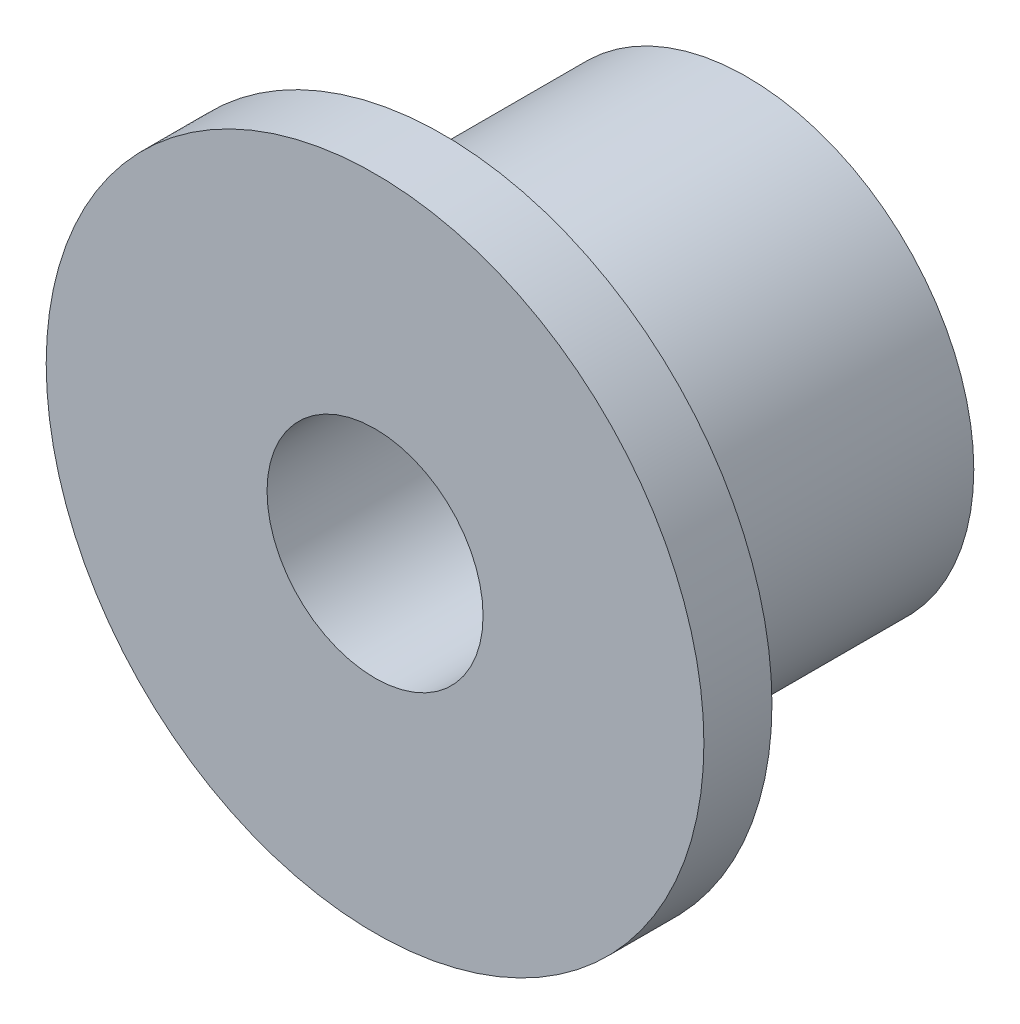
ISO-10303-21;
HEADER;
FILE_DESCRIPTION(('STEP AP214'),'2;1');
FILE_NAME('part.step','',(''),(''),'','','');
FILE_SCHEMA(('AUTOMOTIVE_DESIGN { 1 0 10303 214 1 1 1 1 }'));
ENDSEC;
DATA;
#1=APPLICATION_CONTEXT('core data for automotive mechanical design processes');
#2=APPLICATION_PROTOCOL_DEFINITION('international standard','automotive_design',2000,#1);
#3=PRODUCT_CONTEXT('',#1,'mechanical');
#4=PRODUCT('Part','Part','',(#3));
#5=PRODUCT_RELATED_PRODUCT_CATEGORY('part','',(#4));
#6=PRODUCT_DEFINITION_FORMATION('','',#4);
#7=PRODUCT_DEFINITION_CONTEXT('part definition',#1,'design');
#8=PRODUCT_DEFINITION('design','',#6,#7);
#9=PRODUCT_DEFINITION_SHAPE('','',#8);
#10=(LENGTH_UNIT() NAMED_UNIT(*) SI_UNIT(.MILLI.,.METRE.));
#11=(NAMED_UNIT(*) PLANE_ANGLE_UNIT() SI_UNIT($,.RADIAN.));
#12=(NAMED_UNIT(*) SI_UNIT($,.STERADIAN.) SOLID_ANGLE_UNIT());
#13=UNCERTAINTY_MEASURE_WITH_UNIT(LENGTH_MEASURE(1.E-05),#10,'distance_accuracy_value','');
#14=(GEOMETRIC_REPRESENTATION_CONTEXT(3) GLOBAL_UNCERTAINTY_ASSIGNED_CONTEXT((#13)) GLOBAL_UNIT_ASSIGNED_CONTEXT((#10,
#11,#12)) REPRESENTATION_CONTEXT('',''));
#15=CARTESIAN_POINT('',(0.,0.,0.));
#16=DIRECTION('',(0.,0.,1.));
#17=DIRECTION('',(1.,0.,0.));
#18=AXIS2_PLACEMENT_3D('',#15,#16,#17);
#19=CARTESIAN_POINT('',(0.,0.,13.4));
#20=DIRECTION('',(0.,0.,-1.));
#21=DIRECTION('',(-1.,0.,0.));
#22=AXIS2_PLACEMENT_3D('',#19,#20,#21);
#23=CYLINDRICAL_SURFACE('',#22,10.);
#24=CARTESIAN_POINT('',(-10.,0.,3.10135));
#25=CARTESIAN_POINT('',(-9.99999807889717,-0.105630906606958,3.10135400979978));
#26=CARTESIAN_POINT('',(-9.99830905508266,-0.211313706373756,3.1101949099823));
#27=CARTESIAN_POINT('',(-9.9917340246457,-0.419699538385889,3.1453011710081));
#28=CARTESIAN_POINT('',(-9.98684534912178,-0.522400008249302,3.17158107837378));
#29=CARTESIAN_POINT('',(-9.97441769646418,-0.721777481646431,3.24073029563269));
#30=CARTESIAN_POINT('',(-9.96688114028895,-0.818459892759873,3.28358445527601));
#31=CARTESIAN_POINT('',(-9.94998002730272,-1.00325392377237,3.38462232481265));
#32=CARTESIAN_POINT('',(-9.94061561121401,-1.09136620268223,3.44280485473414));
#33=CARTESIAN_POINT('',(-9.92096340930211,-1.25760801520177,3.57360523818291));
#34=CARTESIAN_POINT('',(-9.91066660937305,-1.33561724095234,3.64637465925976));
#35=CARTESIAN_POINT('',(-9.89037681043919,-1.47839759469912,3.80395716725432));
#36=CARTESIAN_POINT('',(-9.88038383364511,-1.54316775683646,3.88877113212));
#37=CARTESIAN_POINT('',(-9.86174542912829,-1.65813394633244,4.06888819774942));
#38=CARTESIAN_POINT('',(-9.85311161924341,-1.70820718666333,4.16427097986048));
#39=CARTESIAN_POINT('',(-9.83829629605671,-1.79157199611831,4.36228646535904));
#40=CARTESIAN_POINT('',(-9.8321145656518,-1.82486505100314,4.464918525959));
#41=CARTESIAN_POINT('',(-9.82299413227157,-1.8733374871011,4.67323061268751));
#42=CARTESIAN_POINT('',(-9.82001785391403,-1.88872691612654,4.77886008457064));
#43=CARTESIAN_POINT('',(-9.81753205644114,-1.90160731117831,4.99124051199451));
#44=CARTESIAN_POINT('',(-9.81802221844198,-1.89909992356345,5.0979913634755));
#45=CARTESIAN_POINT('',(-9.82237972220902,-1.87642809108027,5.30805975561375));
#46=CARTESIAN_POINT('',(-9.8262013102144,-1.85650285248953,5.4114042023592));
#47=CARTESIAN_POINT('',(-9.83671916983489,-1.79993779578901,5.61325626616075));
#48=CARTESIAN_POINT('',(-9.84341556641127,-1.76329725109924,5.71176367275447));
#49=CARTESIAN_POINT('',(-9.85897616299219,-1.67410876046843,5.90184335076879));
#50=CARTESIAN_POINT('',(-9.86785341679128,-1.62146455456073,5.99336934265211));
#51=CARTESIAN_POINT('',(-9.88676689966655,-1.50183116575577,6.16637859031468));
#52=CARTESIAN_POINT('',(-9.89680324919941,-1.43484049131154,6.24786080049184));
#53=CARTESIAN_POINT('',(-9.91710322965558,-1.28712774204752,6.399851244252));
#54=CARTESIAN_POINT('',(-9.9273679115322,-1.20620114723431,6.47016072447889));
#55=CARTESIAN_POINT('',(-9.94681894251083,-1.03359725749379,6.59623624854671));
#56=CARTESIAN_POINT('',(-9.95600528027342,-0.941919849535832,6.65200213946104));
#57=CARTESIAN_POINT('',(-9.9722838335876,-0.750206912904712,6.747438156358));
#58=CARTESIAN_POINT('',(-9.97937330724643,-0.650160658240755,6.78708723286129));
#59=CARTESIAN_POINT('',(-9.99063822582987,-0.444663242269928,6.84896116031349));
#60=CARTESIAN_POINT('',(-9.99481398829464,-0.339212671277699,6.87118791000358));
#61=CARTESIAN_POINT('',(-9.99973726008908,-0.127609557260542,6.89730872824811));
#62=CARTESIAN_POINT('',(-10.0005356786427,-0.0214917693696443,6.90147505895894));
#63=CARTESIAN_POINT('',(-9.99875507295464,0.189924050059223,6.89208762760934));
#64=CARTESIAN_POINT('',(-9.99617621904292,0.295222122669424,6.87853475920193));
#65=CARTESIAN_POINT('',(-9.98796256283426,0.501143184157762,6.83431997477619));
#66=CARTESIAN_POINT('',(-9.98235244136965,0.601796900421689,6.80379618002715));
#67=CARTESIAN_POINT('',(-9.96870275552083,0.796558038008519,6.72665573955089));
#68=CARTESIAN_POINT('',(-9.96066302295114,0.890665005589466,6.68003797971585));
#69=CARTESIAN_POINT('',(-9.94291894138318,1.0708207126208,6.57143283193516));
#70=CARTESIAN_POINT('',(-9.93319699668983,1.15676766556673,6.50927953307866));
#71=CARTESIAN_POINT('',(-9.91321153661073,1.31710952119022,6.37159168154247));
#72=CARTESIAN_POINT('',(-9.90294796934694,1.3915033145751,6.29605584540871));
#73=CARTESIAN_POINT('',(-9.88286663737182,1.52766463915467,6.13251323499482));
#74=CARTESIAN_POINT('',(-9.87305686033625,1.5892461597737,6.04435044787823));
#75=CARTESIAN_POINT('',(-9.85515610923605,1.6967260003097,5.85877179025352));
#76=CARTESIAN_POINT('',(-9.847065070319,1.74262491201174,5.76135626907572));
#77=CARTESIAN_POINT('',(-9.83358091959549,1.81717471109198,5.56050387049354));
#78=CARTESIAN_POINT('',(-9.82817463278666,1.84590997032104,5.45709923513715));
#79=CARTESIAN_POINT('',(-9.82064240267116,1.88557621338675,5.24681706064941));
#80=CARTESIAN_POINT('',(-9.81851607875718,1.89650926300219,5.13993992593715));
#81=CARTESIAN_POINT('',(-9.81780416848873,1.90019025200711,4.92761060943521));
#82=CARTESIAN_POINT('',(-9.819161434507,1.89323169643434,4.82216359623754));
#83=CARTESIAN_POINT('',(-9.8251368772071,1.86197054399754,4.61397168287319));
#84=CARTESIAN_POINT('',(-9.8297550332212,1.83766805706047,4.51122676558473));
#85=CARTESIAN_POINT('',(-9.84170756346174,1.77253406311887,4.31151881115716));
#86=CARTESIAN_POINT('',(-9.84903658444355,1.73173511758465,4.21454481319182));
#87=CARTESIAN_POINT('',(-9.86558869490061,1.63479872406915,4.02877161162287));
#88=CARTESIAN_POINT('',(-9.87481192285349,1.57866015457224,3.93997300637616));
#89=CARTESIAN_POINT('',(-9.89429014960132,1.45162099656805,3.77160264262215));
#90=CARTESIAN_POINT('',(-9.90455880912494,1.3805071039544,3.69219337923302));
#91=CARTESIAN_POINT('',(-9.92486945421305,1.22597994636198,3.54633734756528));
#92=CARTESIAN_POINT('',(-9.93491138716965,1.14256386001851,3.47989356090962));
#93=CARTESIAN_POINT('',(-9.95374639818129,0.964873454070765,3.36127813357212));
#94=CARTESIAN_POINT('',(-9.96252703989848,0.870505669409245,3.30924446779801));
#95=CARTESIAN_POINT('',(-9.97772852300823,0.674229958666759,3.2218538096183));
#96=CARTESIAN_POINT('',(-9.98415156322756,0.572329165412168,3.18648126937741));
#97=CARTESIAN_POINT('',(-9.99261598534821,0.391784649979565,3.1405381377255));
#98=CARTESIAN_POINT('',(-9.99536924894644,0.314191479390444,3.12586790010971));
#99=CARTESIAN_POINT('',(-9.99906194954111,0.157741830645322,3.10627246331945));
#100=CARTESIAN_POINT('',(-10.0000014346837,0.0788853860785323,3.10134700547298));
#101=CARTESIAN_POINT('',(-10.,0.,3.10135));
#102=B_SPLINE_CURVE_WITH_KNOTS('',3,(#24,#25,#26,#27,#28,#29,#30,#31,#32,#33,#34,#35,#36,#37,
#38,#39,#40,#41,#42,#43,#44,#45,#46,#47,#48,#49,#50,#51,#52,#53,#54,#55,#56,#57,#58,#59,#60,#61,
#62,#63,#64,#65,#66,#67,#68,#69,#70,#71,#72,#73,#74,#75,#76,#77,#78,#79,#80,#81,#82,#83,#84,#85,
#86,#87,#88,#89,#90,#91,#92,#93,#94,#95,#96,#97,#98,#99,#100,#101),.UNSPECIFIED.,.T.,.F.,(4,2,2,
2,2,2,2,2,2,2,2,2,2,2,2,2,2,2,2,2,2,2,2,2,2,2,2,2,2,2,2,2,2,2,2,2,2,2,4),(0.,0.316604213019261,
0.63347284987462,0.950052524308804,1.26660783568321,1.58664090218577,1.90669730844595,
2.2293561461379,2.55198640976602,2.87079209179724,3.1895684467261,3.50403450404346,
3.81851423185622,4.13492425194273,4.45136718394131,4.77292697700731,5.09449015115478,
5.4164719660808,5.73841868551294,6.05549477457644,6.37255487278874,6.6870715088799,
7.00160992181244,7.31966279596852,7.63774618955738,7.96016709951794,8.28257584154398,
8.6033863801012,8.92415968896281,9.23970452705555,9.55524736522214,9.87017038741915,
10.1851164405355,10.5048953364621,10.8247476843228,11.1475642878913,11.4700790455748,
11.7065260228082,11.9429667235497),.UNSPECIFIED.);
#103=CARTESIAN_POINT('',(-10.,0.,3.10135));
#104=VERTEX_POINT('',#103);
#105=EDGE_CURVE('E63',#104,#104,#102,.T.);
#106=ORIENTED_EDGE('',*,*,#105,.F.);
#107=EDGE_LOOP('',(#106));
#108=FACE_BOUND('',#107,.T.);
#109=CARTESIAN_POINT('',(0.,0.,13.4));
#110=DIRECTION('',(0.,0.,1.));
#111=DIRECTION('',(1.,0.,0.));
#112=AXIS2_PLACEMENT_3D('',#109,#110,#111);
#113=CIRCLE('',#112,10.);
#114=CARTESIAN_POINT('',(10.,0.,13.4));
#115=VERTEX_POINT('',#114);
#116=EDGE_CURVE('E10',#115,#115,#113,.T.);
#117=ORIENTED_EDGE('',*,*,#116,.F.);
#118=EDGE_LOOP('',(#117));
#119=FACE_BOUND('',#118,.T.);
#120=CARTESIAN_POINT('',(0.,0.,0.));
#121=DIRECTION('',(0.,0.,1.));
#122=DIRECTION('',(1.,0.,0.));
#123=AXIS2_PLACEMENT_3D('',#120,#121,#122);
#124=CIRCLE('',#123,10.);
#125=CARTESIAN_POINT('',(10.,0.,0.));
#126=VERTEX_POINT('',#125);
#127=EDGE_CURVE('E45',#126,#126,#124,.T.);
#128=ORIENTED_EDGE('',*,*,#127,.T.);
#129=EDGE_LOOP('',(#128));
#130=FACE_BOUND('',#129,.T.);
#131=ADVANCED_FACE('F33',(#108,#119,#130),#23,.T.);
#132=CARTESIAN_POINT('',(0.,0.,0.));
#133=DIRECTION('',(0.,0.,1.));
#134=DIRECTION('',(1.,0.,0.));
#135=AXIS2_PLACEMENT_3D('',#132,#133,#134);
#136=PLANE('',#135);
#137=CARTESIAN_POINT('',(0.,0.,0.));
#138=DIRECTION('',(0.,0.,1.));
#139=DIRECTION('',(1.,0.,0.));
#140=AXIS2_PLACEMENT_3D('',#137,#138,#139);
#141=CIRCLE('',#140,4.7625);
#142=CARTESIAN_POINT('',(4.7625,0.,0.));
#143=VERTEX_POINT('',#142);
#144=EDGE_CURVE('E55',#143,#143,#141,.F.);
#145=ORIENTED_EDGE('',*,*,#144,.F.);
#146=EDGE_LOOP('',(#145));
#147=FACE_BOUND('',#146,.T.);
#148=ORIENTED_EDGE('',*,*,#127,.F.);
#149=EDGE_LOOP('',(#148));
#150=FACE_BOUND('',#149,.T.);
#151=ADVANCED_FACE('F86',(#147,#150),#136,.F.);
#152=CARTESIAN_POINT('',(0.,0.,16.4));
#153=DIRECTION('',(0.,0.,-1.));
#154=DIRECTION('',(-1.,0.,0.));
#155=AXIS2_PLACEMENT_3D('',#152,#153,#154);
#156=CYLINDRICAL_SURFACE('',#155,14.5);
#157=CARTESIAN_POINT('',(0.,0.,16.4));
#158=DIRECTION('',(0.,0.,1.));
#159=DIRECTION('',(1.,0.,0.));
#160=AXIS2_PLACEMENT_3D('',#157,#158,#159);
#161=CIRCLE('',#160,14.5);
#162=CARTESIAN_POINT('',(14.5,0.,16.4));
#163=VERTEX_POINT('',#162);
#164=EDGE_CURVE('E50',#163,#163,#161,.T.);
#165=ORIENTED_EDGE('',*,*,#164,.F.);
#166=EDGE_LOOP('',(#165));
#167=FACE_BOUND('',#166,.T.);
#168=CARTESIAN_POINT('',(0.,0.,13.4));
#169=DIRECTION('',(0.,0.,1.));
#170=DIRECTION('',(1.,0.,0.));
#171=AXIS2_PLACEMENT_3D('',#168,#169,#170);
#172=CIRCLE('',#171,14.5);
#173=CARTESIAN_POINT('',(14.5,0.,13.4));
#174=VERTEX_POINT('',#173);
#175=EDGE_CURVE('E52',#174,#174,#172,.T.);
#176=ORIENTED_EDGE('',*,*,#175,.T.);
#177=EDGE_LOOP('',(#176));
#178=FACE_BOUND('',#177,.T.);
#179=ADVANCED_FACE('F81',(#167,#178),#156,.T.);
#180=CARTESIAN_POINT('',(0.,0.,16.4));
#181=DIRECTION('',(0.,0.,1.));
#182=DIRECTION('',(1.,0.,0.));
#183=AXIS2_PLACEMENT_3D('',#180,#181,#182);
#184=PLANE('',#183);
#185=CARTESIAN_POINT('',(0.,0.,16.4));
#186=DIRECTION('',(0.,0.,1.));
#187=DIRECTION('',(1.,0.,0.));
#188=AXIS2_PLACEMENT_3D('',#185,#186,#187);
#189=CIRCLE('',#188,4.7625);
#190=CARTESIAN_POINT('',(4.7625,0.,16.4));
#191=VERTEX_POINT('',#190);
#192=EDGE_CURVE('E60',#191,#191,#189,.T.);
#193=ORIENTED_EDGE('',*,*,#192,.F.);
#194=EDGE_LOOP('',(#193));
#195=FACE_BOUND('',#194,.T.);
#196=ORIENTED_EDGE('',*,*,#164,.T.);
#197=EDGE_LOOP('',(#196));
#198=FACE_BOUND('',#197,.T.);
#199=ADVANCED_FACE('F78',(#195,#198),#184,.T.);
#200=CARTESIAN_POINT('',(0.,0.,13.4));
#201=DIRECTION('',(0.,0.,1.));
#202=DIRECTION('',(1.,0.,0.));
#203=AXIS2_PLACEMENT_3D('',#200,#201,#202);
#204=PLANE('',#203);
#205=ORIENTED_EDGE('',*,*,#116,.T.);
#206=EDGE_LOOP('',(#205));
#207=FACE_BOUND('',#206,.T.);
#208=ORIENTED_EDGE('',*,*,#175,.F.);
#209=EDGE_LOOP('',(#208));
#210=FACE_BOUND('',#209,.T.);
#211=ADVANCED_FACE('F76',(#207,#210),#204,.F.);
#212=CARTESIAN_POINT('',(0.,0.,-13.4703841816037));
#213=DIRECTION('',(0.,0.,1.));
#214=DIRECTION('',(1.,0.,0.));
#215=AXIS2_PLACEMENT_3D('',#212,#213,#214);
#216=CYLINDRICAL_SURFACE('',#215,4.7625);
#217=CARTESIAN_POINT('',(-4.7625,0.,3.10135));
#218=CARTESIAN_POINT('',(-4.76249320468019,-0.102072732802169,3.10135919846461));
#219=CARTESIAN_POINT('',(-4.75917998378663,-0.204323843263765,3.10963035749761));
#220=CARTESIAN_POINT('',(-4.74624988990346,-0.405945129545357,3.14242896662497));
#221=CARTESIAN_POINT('',(-4.73661582945688,-0.505306676606562,3.16700074295097));
#222=CARTESIAN_POINT('',(-4.71208245615527,-0.697908111979028,3.23136607032226));
#223=CARTESIAN_POINT('',(-4.69720034406703,-0.791166832748215,3.27110992877388));
#224=CARTESIAN_POINT('',(-4.663638008034,-0.969608660348233,3.36449459103961));
#225=CARTESIAN_POINT('',(-4.64495911631646,-1.05479458445981,3.41813052216019));
#226=CARTESIAN_POINT('',(-4.60471481208072,-1.21878627258539,3.54043304291465));
#227=CARTESIAN_POINT('',(-4.58306020082771,-1.29716427102274,3.60964365859838));
#228=CARTESIAN_POINT('',(-4.53971364677036,-1.44156213674205,3.75998280142252));
#229=CARTESIAN_POINT('',(-4.51802169095542,-1.50757599303174,3.84111709138549));
#230=CARTESIAN_POINT('',(-4.47599224052039,-1.62824076342582,4.0173504392183));
#231=CARTESIAN_POINT('',(-4.45575680285061,-1.68226145917271,4.11290784088936));
#232=CARTESIAN_POINT('',(-4.42032963321522,-1.77327244583728,4.31268028980831));
#233=CARTESIAN_POINT('',(-4.4051355225952,-1.81027077163231,4.41689122494804));
#234=CARTESIAN_POINT('',(-4.38246834909209,-1.86445971420239,4.62609869127764));
#235=CARTESIAN_POINT('',(-4.37467781021693,-1.88246882310001,4.73084756655336));
#236=CARTESIAN_POINT('',(-4.36677914122406,-1.90072498055105,4.94214792924183));
#237=CARTESIAN_POINT('',(-4.3666672678416,-1.90098068369468,5.04869851300133));
#238=CARTESIAN_POINT('',(-4.37386758167741,-1.88434337128059,5.2527330753514));
#239=CARTESIAN_POINT('',(-4.38066767538534,-1.86863324524977,5.350335083644));
#240=CARTESIAN_POINT('',(-4.40006668661631,-1.82248163889271,5.54138135301221));
#241=CARTESIAN_POINT('',(-4.41266660852831,-1.79203760696595,5.63482489086695));
#242=CARTESIAN_POINT('',(-4.44252146205763,-1.71670425822983,5.81714685280051));
#243=CARTESIAN_POINT('',(-4.45986584019041,-1.67153379473005,5.90589381107161));
#244=CARTESIAN_POINT('',(-4.49723046626318,-1.56822711507661,6.07487284430872));
#245=CARTESIAN_POINT('',(-4.51725171386383,-1.51008604968095,6.15510171806865));
#246=CARTESIAN_POINT('',(-4.5595857320369,-1.37724352720787,6.31124621151458));
#247=CARTESIAN_POINT('',(-4.58195644631839,-1.3016135996436,6.38635831768514));
#248=CARTESIAN_POINT('',(-4.62516166085846,-1.1385915471098,6.52308941896388));
#249=CARTESIAN_POINT('',(-4.64599585867525,-1.05119711597625,6.58470576229678));
#250=CARTESIAN_POINT('',(-4.68429629505369,-0.864860340326758,6.69374130521318));
#251=CARTESIAN_POINT('',(-4.70168890565653,-0.765725983758225,6.74086010957167));
#252=CARTESIAN_POINT('',(-4.73059042235752,-0.560068761495479,6.81747596201241));
#253=CARTESIAN_POINT('',(-4.74210229629583,-0.453549653562998,6.84698190007574));
#254=CARTESIAN_POINT('',(-4.75740540955307,-0.242883236480853,6.88591381101998));
#255=CARTESIAN_POINT('',(-4.76161130144803,-0.13896551667409,6.89641972536937));
#256=CARTESIAN_POINT('',(-4.7631333664281,0.0692230130654902,6.90023976379261));
#257=CARTESIAN_POINT('',(-4.76045131070612,0.173493725342502,6.89355830749125));
#258=CARTESIAN_POINT('',(-4.74877038328457,0.374545841677289,6.86398884410802));
#259=CARTESIAN_POINT('',(-4.7400583650246,0.471453916112845,6.84183639738919));
#260=CARTESIAN_POINT('',(-4.7174907314058,0.660089318303665,6.78295286541891));
#261=CARTESIAN_POINT('',(-4.70363445462627,0.751815978112814,6.74621990544254));
#262=CARTESIAN_POINT('',(-4.671598293187,0.930635737079243,6.65802049141434));
#263=CARTESIAN_POINT('',(-4.65329929924161,1.01750180423997,6.60613837313231));
#264=CARTESIAN_POINT('',(-4.61436378185078,1.18159938142141,6.48957499729241));
#265=CARTESIAN_POINT('',(-4.59372632659221,1.25882702485215,6.42488862986743));
#266=CARTESIAN_POINT('',(-4.55068452861481,1.40676849112361,6.27957635524444));
#267=CARTESIAN_POINT('',(-4.5282530773816,1.47672286536862,6.19818327090232));
#268=CARTESIAN_POINT('',(-4.485407477204,1.60216466315789,6.02441405584194));
#269=CARTESIAN_POINT('',(-4.4649936518673,1.65764976830205,5.93203616848529));
#270=CARTESIAN_POINT('',(-4.4284701661246,1.75291129851249,5.73756299703167));
#271=CARTESIAN_POINT('',(-4.41240255175607,1.79253593434841,5.63538490139861));
#272=CARTESIAN_POINT('',(-4.38705750793613,1.85371249744203,5.42497338305287));
#273=CARTESIAN_POINT('',(-4.3777751129666,1.87527764257337,5.31674445099312));
#274=CARTESIAN_POINT('',(-4.36776623373883,1.89846491888753,5.10564833359122));
#275=CARTESIAN_POINT('',(-4.36647506303743,1.90140364517339,5.00295162665708));
#276=CARTESIAN_POINT('',(-4.37111721328148,1.89070740446982,4.79860171021233));
#277=CARTESIAN_POINT('',(-4.37704963049645,1.87707451072722,4.69694837177208));
#278=CARTESIAN_POINT('',(-4.39497389164138,1.83469465796553,4.50163291986979));
#279=CARTESIAN_POINT('',(-4.40672026257986,1.80655821088816,4.4078137621416));
#280=CARTESIAN_POINT('',(-4.43477767953585,1.73653918240864,4.22618910939218));
#281=CARTESIAN_POINT('',(-4.45108998413154,1.69465281035338,4.1383852807865));
#282=CARTESIAN_POINT('',(-4.48759629111836,1.59556302961161,3.96583056440748));
#283=CARTESIAN_POINT('',(-4.5079585796732,1.5376224923271,3.8815391502486));
#284=CARTESIAN_POINT('',(-4.54975388625955,1.40915029870134,3.72346243395825));
#285=CARTESIAN_POINT('',(-4.5711872217137,1.33861489353107,3.64968027166441));
#286=CARTESIAN_POINT('',(-4.61436440236714,1.18156183782342,3.50985519314422));
#287=CARTESIAN_POINT('',(-4.63603979038251,1.09430870289323,3.44461360248284));
#288=CARTESIAN_POINT('',(-4.67585027274879,0.909270204909278,3.32968355263781));
#289=CARTESIAN_POINT('',(-4.6939837155526,0.811479961404766,3.28000234250264));
#290=CARTESIAN_POINT('',(-4.72435781296178,0.609952904380792,3.19877346019344));
#291=CARTESIAN_POINT('',(-4.73670263301614,0.506362061963908,3.16690309195682));
#292=CARTESIAN_POINT('',(-4.75453588138578,0.294897527592457,3.12129536096509));
#293=CARTESIAN_POINT('',(-4.76004608716876,0.187038574839198,3.10750039570098));
#294=CARTESIAN_POINT('',(-4.76228355491803,0.0526410833954346,3.10189485802985));
#295=CARTESIAN_POINT('',(-4.7625017526406,0.0263264747257102,3.10134762754323));
#296=CARTESIAN_POINT('',(-4.7625,0.,3.10135));
#297=B_SPLINE_CURVE_WITH_KNOTS('',3,(#217,#218,#219,#220,#221,#222,#223,#224,#225,#226,#227,
#228,#229,#230,#231,#232,#233,#234,#235,#236,#237,#238,#239,#240,#241,#242,#243,#244,#245,#246,
#247,#248,#249,#250,#251,#252,#253,#254,#255,#256,#257,#258,#259,#260,#261,#262,#263,#264,#265,
#266,#267,#268,#269,#270,#271,#272,#273,#274,#275,#276,#277,#278,#279,#280,#281,#282,#283,#284,
#285,#286,#287,#288,#289,#290,#291,#292,#293,#294,#295,#296),.UNSPECIFIED.,.T.,.F.,(4,2,2,2,2,2,
2,2,2,2,2,2,2,2,2,2,2,2,2,2,2,2,2,2,2,2,2,2,2,2,2,2,2,2,2,2,2,2,2,4),(0.,0.306148253780951,
0.613132447174016,0.919119694629609,1.22499976097994,1.54394122193962,1.86303734032263,
2.19621911645722,2.52924346279922,2.84723993037011,3.1650813770685,3.46097606376103,
3.75692201149443,4.05888581395966,4.36096269959934,4.68622177111353,5.011544695391,
5.3432137939545,5.67471534280485,5.98669955955127,6.29860355952909,6.59660670766996,
6.89464818470765,7.20179098568957,7.50905660798071,7.83647522984817,8.16394628156541,
8.49448040831553,8.82477240275467,9.13143057243017,9.43805038057877,9.73270580401245,
10.0274425279509,10.3389833366048,10.6506170295979,10.9822641672415,11.3140655789076,
11.639642486308,11.9641793045991,12.0431406887437),.UNSPECIFIED.);
#298=CARTESIAN_POINT('',(-4.7625,0.,3.10135));
#299=VERTEX_POINT('',#298);
#300=EDGE_CURVE('E36',#299,#299,#297,.T.);
#301=ORIENTED_EDGE('',*,*,#300,.T.);
#302=EDGE_LOOP('',(#301));
#303=FACE_BOUND('',#302,.T.);
#304=ORIENTED_EDGE('',*,*,#144,.T.);
#305=EDGE_LOOP('',(#304));
#306=FACE_BOUND('',#305,.T.);
#307=ORIENTED_EDGE('',*,*,#192,.T.);
#308=EDGE_LOOP('',(#307));
#309=FACE_BOUND('',#308,.T.);
#310=ADVANCED_FACE('F72',(#303,#306,#309),#216,.F.);
#311=CARTESIAN_POINT('',(-14.501,0.,5.));
#312=DIRECTION('',(1.,0.,0.));
#313=DIRECTION('',(0.,0.,-1.));
#314=AXIS2_PLACEMENT_3D('',#311,#312,#313);
#315=CYLINDRICAL_SURFACE('',#314,1.89865);
#316=ORIENTED_EDGE('',*,*,#105,.T.);
#317=EDGE_LOOP('',(#316));
#318=FACE_BOUND('',#317,.T.);
#319=ORIENTED_EDGE('',*,*,#300,.F.);
#320=EDGE_LOOP('',(#319));
#321=FACE_BOUND('',#320,.T.);
#322=ADVANCED_FACE('F69',(#318,#321),#315,.F.);
#323=CLOSED_SHELL('',(#131,#151,#179,#199,#211,#310,#322));
#324=MANIFOLD_SOLID_BREP('B2',#323);
#325=ADVANCED_BREP_SHAPE_REPRESENTATION('',(#18,#324),#14);
#326=SHAPE_DEFINITION_REPRESENTATION(#9,#325);
ENDSEC;
END-ISO-10303-21;
